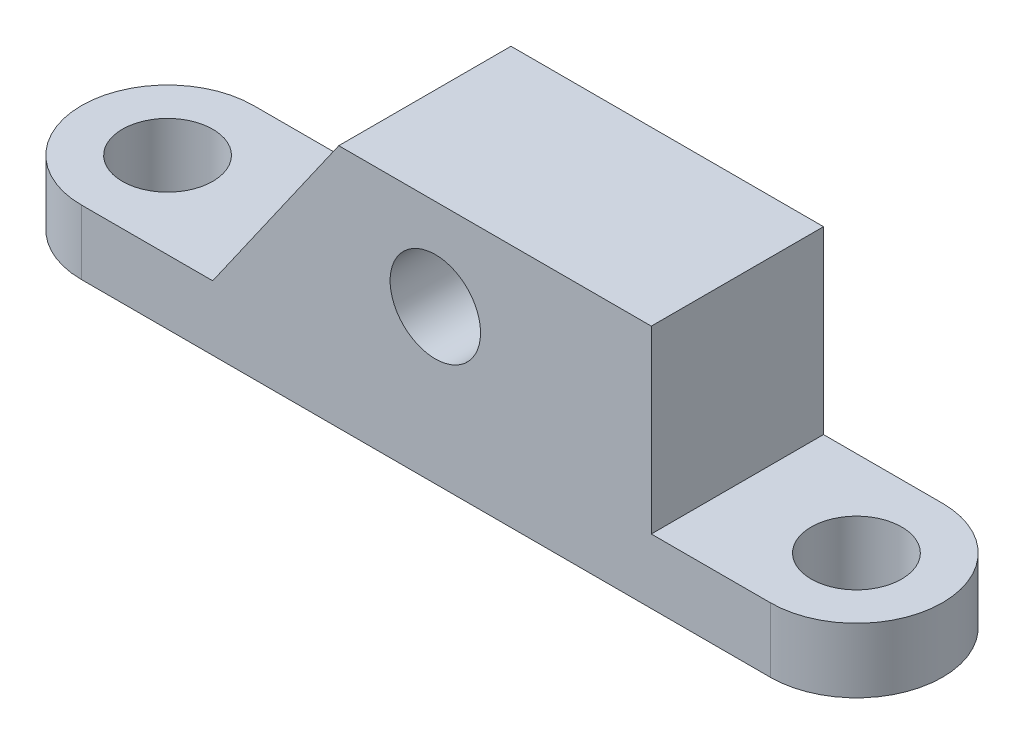
ISO-10303-21;
HEADER;
FILE_DESCRIPTION(('STEP AP214'),'2;1');
FILE_NAME('part.step','',(''),(''),'','','');
FILE_SCHEMA(('AUTOMOTIVE_DESIGN { 1 0 10303 214 1 1 1 1 }'));
ENDSEC;
DATA;
#1=APPLICATION_CONTEXT('core data for automotive mechanical design processes');
#2=APPLICATION_PROTOCOL_DEFINITION('international standard','automotive_design',2000,#1);
#3=PRODUCT_CONTEXT('',#1,'mechanical');
#4=PRODUCT('Part','Part','',(#3));
#5=PRODUCT_RELATED_PRODUCT_CATEGORY('part','',(#4));
#6=PRODUCT_DEFINITION_FORMATION('','',#4);
#7=PRODUCT_DEFINITION_CONTEXT('part definition',#1,'design');
#8=PRODUCT_DEFINITION('design','',#6,#7);
#9=PRODUCT_DEFINITION_SHAPE('','',#8);
#10=(LENGTH_UNIT() NAMED_UNIT(*) SI_UNIT(.MILLI.,.METRE.));
#11=(NAMED_UNIT(*) PLANE_ANGLE_UNIT() SI_UNIT($,.RADIAN.));
#12=(NAMED_UNIT(*) SI_UNIT($,.STERADIAN.) SOLID_ANGLE_UNIT());
#13=UNCERTAINTY_MEASURE_WITH_UNIT(LENGTH_MEASURE(1.E-05),#10,'distance_accuracy_value','');
#14=(GEOMETRIC_REPRESENTATION_CONTEXT(3) GLOBAL_UNCERTAINTY_ASSIGNED_CONTEXT((#13)) GLOBAL_UNIT_ASSIGNED_CONTEXT((#10,
#11,#12)) REPRESENTATION_CONTEXT('',''));
#15=CARTESIAN_POINT('',(0.,0.,0.));
#16=DIRECTION('',(0.,0.,1.));
#17=DIRECTION('',(1.,0.,0.));
#18=AXIS2_PLACEMENT_3D('',#15,#16,#17);
#19=CARTESIAN_POINT('',(0.,3.,0.));
#20=DIRECTION('',(0.,1.,0.));
#21=DIRECTION('',(0.,0.,1.));
#22=AXIS2_PLACEMENT_3D('',#19,#20,#21);
#23=PLANE('',#22);
#24=CARTESIAN_POINT('',(32.,3.,0.));
#25=DIRECTION('',(0.,1.,0.));
#26=DIRECTION('',(0.,0.,1.));
#27=AXIS2_PLACEMENT_3D('',#24,#25,#26);
#28=CIRCLE('',#27,2.1);
#29=CARTESIAN_POINT('',(32.,3.,2.1));
#30=VERTEX_POINT('',#29);
#31=EDGE_CURVE('E180',#30,#30,#28,.T.);
#32=ORIENTED_EDGE('',*,*,#31,.F.);
#33=EDGE_LOOP('',(#32));
#34=FACE_BOUND('',#33,.T.);
#35=DIRECTION('',(-1.,0.,0.));
#36=VECTOR('',#35,1.);
#37=CARTESIAN_POINT('',(0.,3.,-4.));
#38=LINE('',#37,#36);
#39=CARTESIAN_POINT('',(32.,3.,-4.));
#40=VERTEX_POINT('',#39);
#41=CARTESIAN_POINT('',(26.470573602195,3.,-4.));
#42=VERTEX_POINT('',#41);
#43=EDGE_CURVE('E121',#40,#42,#38,.T.);
#44=ORIENTED_EDGE('',*,*,#43,.T.);
#45=DIRECTION('',(0.,0.,1.));
#46=VECTOR('',#45,1.);
#47=CARTESIAN_POINT('',(26.470573602195,3.,-4.));
#48=LINE('',#47,#46);
#49=CARTESIAN_POINT('',(26.470573602195,3.,4.));
#50=VERTEX_POINT('',#49);
#51=EDGE_CURVE('E107',#42,#50,#48,.T.);
#52=ORIENTED_EDGE('',*,*,#51,.T.);
#53=DIRECTION('',(1.,0.,0.));
#54=VECTOR('',#53,1.);
#55=CARTESIAN_POINT('',(0.,3.,4.));
#56=LINE('',#55,#54);
#57=CARTESIAN_POINT('',(32.,3.,4.));
#58=VERTEX_POINT('',#57);
#59=EDGE_CURVE('E190',#50,#58,#56,.T.);
#60=ORIENTED_EDGE('',*,*,#59,.T.);
#61=CARTESIAN_POINT('',(32.,3.,0.));
#62=DIRECTION('',(0.,1.,0.));
#63=DIRECTION('',(0.,0.,1.));
#64=AXIS2_PLACEMENT_3D('',#61,#62,#63);
#65=CIRCLE('',#64,4.);
#66=EDGE_CURVE('E128',#58,#40,#65,.T.);
#67=ORIENTED_EDGE('',*,*,#66,.T.);
#68=EDGE_LOOP('',(#44,#52,#60,#67));
#69=FACE_BOUND('',#68,.T.);
#70=ADVANCED_FACE('F33',(#34,#69),#23,.T.);
#71=DIRECTION('',(0.,0.,1.));
#72=VECTOR('',#71,1.);
#73=CARTESIAN_POINT('',(6.09701451269219,3.,-4.));
#74=LINE('',#73,#72);
#75=CARTESIAN_POINT('',(6.09701451269219,3.,-4.));
#76=VERTEX_POINT('',#75);
#77=CARTESIAN_POINT('',(6.09701451269219,3.,4.));
#78=VERTEX_POINT('',#77);
#79=EDGE_CURVE('E175',#76,#78,#74,.T.);
#80=ORIENTED_EDGE('',*,*,#79,.F.);
#81=CARTESIAN_POINT('',(0.,3.,-4.));
#82=VERTEX_POINT('',#81);
#83=EDGE_CURVE('E57',#76,#82,#38,.T.);
#84=ORIENTED_EDGE('',*,*,#83,.T.);
#85=CARTESIAN_POINT('',(0.,3.,0.));
#86=DIRECTION('',(0.,1.,0.));
#87=DIRECTION('',(0.,0.,1.));
#88=AXIS2_PLACEMENT_3D('',#85,#86,#87);
#89=CIRCLE('',#88,4.);
#90=CARTESIAN_POINT('',(0.,3.,4.));
#91=VERTEX_POINT('',#90);
#92=EDGE_CURVE('E145',#82,#91,#89,.T.);
#93=ORIENTED_EDGE('',*,*,#92,.T.);
#94=EDGE_CURVE('E86',#91,#78,#56,.T.);
#95=ORIENTED_EDGE('',*,*,#94,.T.);
#96=EDGE_LOOP('',(#80,#84,#93,#95));
#97=FACE_BOUND('',#96,.T.);
#98=CARTESIAN_POINT('',(0.,3.,0.));
#99=DIRECTION('',(0.,1.,0.));
#100=DIRECTION('',(0.,0.,1.));
#101=AXIS2_PLACEMENT_3D('',#98,#99,#100);
#102=CIRCLE('',#101,2.1);
#103=CARTESIAN_POINT('',(0.,3.,2.1));
#104=VERTEX_POINT('',#103);
#105=EDGE_CURVE('E141',#104,#104,#102,.T.);
#106=ORIENTED_EDGE('',*,*,#105,.F.);
#107=EDGE_LOOP('',(#106));
#108=FACE_BOUND('',#107,.T.);
#109=ADVANCED_FACE('F194',(#97,#108),#23,.T.);
#110=CARTESIAN_POINT('',(0.,0.,0.));
#111=DIRECTION('',(0.,1.,0.));
#112=DIRECTION('',(0.,0.,1.));
#113=AXIS2_PLACEMENT_3D('',#110,#111,#112);
#114=PLANE('',#113);
#115=CARTESIAN_POINT('',(0.,0.,0.));
#116=DIRECTION('',(0.,1.,0.));
#117=DIRECTION('',(0.,0.,1.));
#118=AXIS2_PLACEMENT_3D('',#115,#116,#117);
#119=CIRCLE('',#118,4.);
#120=CARTESIAN_POINT('',(0.,0.,-4.));
#121=VERTEX_POINT('',#120);
#122=CARTESIAN_POINT('',(0.,0.,4.));
#123=VERTEX_POINT('',#122);
#124=EDGE_CURVE('E137',#121,#123,#119,.T.);
#125=ORIENTED_EDGE('',*,*,#124,.F.);
#126=DIRECTION('',(-1.,0.,0.));
#127=VECTOR('',#126,1.);
#128=CARTESIAN_POINT('',(0.,0.,-4.));
#129=LINE('',#128,#127);
#130=CARTESIAN_POINT('',(32.,0.,-4.));
#131=VERTEX_POINT('',#130);
#132=EDGE_CURVE('E79',#131,#121,#129,.T.);
#133=ORIENTED_EDGE('',*,*,#132,.F.);
#134=CARTESIAN_POINT('',(32.,0.,0.));
#135=DIRECTION('',(0.,1.,0.));
#136=DIRECTION('',(0.,0.,1.));
#137=AXIS2_PLACEMENT_3D('',#134,#135,#136);
#138=CIRCLE('',#137,4.);
#139=CARTESIAN_POINT('',(32.,0.,4.));
#140=VERTEX_POINT('',#139);
#141=EDGE_CURVE('E143',#140,#131,#138,.T.);
#142=ORIENTED_EDGE('',*,*,#141,.F.);
#143=DIRECTION('',(1.,0.,0.));
#144=VECTOR('',#143,1.);
#145=CARTESIAN_POINT('',(0.,0.,4.));
#146=LINE('',#145,#144);
#147=EDGE_CURVE('E140',#123,#140,#146,.T.);
#148=ORIENTED_EDGE('',*,*,#147,.F.);
#149=EDGE_LOOP('',(#125,#133,#142,#148));
#150=FACE_BOUND('',#149,.T.);
#151=CARTESIAN_POINT('',(0.,0.,0.));
#152=DIRECTION('',(0.,1.,0.));
#153=DIRECTION('',(0.,0.,1.));
#154=AXIS2_PLACEMENT_3D('',#151,#152,#153);
#155=CIRCLE('',#154,2.1);
#156=CARTESIAN_POINT('',(0.,0.,2.1));
#157=VERTEX_POINT('',#156);
#158=EDGE_CURVE('E183',#157,#157,#155,.T.);
#159=ORIENTED_EDGE('',*,*,#158,.T.);
#160=EDGE_LOOP('',(#159));
#161=FACE_BOUND('',#160,.T.);
#162=CARTESIAN_POINT('',(32.,0.,0.));
#163=DIRECTION('',(0.,1.,0.));
#164=DIRECTION('',(0.,0.,1.));
#165=AXIS2_PLACEMENT_3D('',#162,#163,#164);
#166=CIRCLE('',#165,2.1);
#167=CARTESIAN_POINT('',(32.,0.,2.1));
#168=VERTEX_POINT('',#167);
#169=EDGE_CURVE('E177',#168,#168,#166,.T.);
#170=ORIENTED_EDGE('',*,*,#169,.T.);
#171=EDGE_LOOP('',(#170));
#172=FACE_BOUND('',#171,.T.);
#173=ADVANCED_FACE('F154',(#150,#161,#172),#114,.F.);
#174=CARTESIAN_POINT('',(0.,3.,0.));
#175=DIRECTION('',(0.,-1.,0.));
#176=DIRECTION('',(0.,0.,-1.));
#177=AXIS2_PLACEMENT_3D('',#174,#175,#176);
#178=CYLINDRICAL_SURFACE('',#177,4.);
#179=ORIENTED_EDGE('',*,*,#124,.T.);
#180=DIRECTION('',(0.,-1.,0.));
#181=VECTOR('',#180,1.);
#182=CARTESIAN_POINT('',(0.,3.,4.));
#183=LINE('',#182,#181);
#184=EDGE_CURVE('E11',#91,#123,#183,.T.);
#185=ORIENTED_EDGE('',*,*,#184,.F.);
#186=ORIENTED_EDGE('',*,*,#92,.F.);
#187=DIRECTION('',(0.,-1.,0.));
#188=VECTOR('',#187,1.);
#189=CARTESIAN_POINT('',(0.,3.,-4.));
#190=LINE('',#189,#188);
#191=EDGE_CURVE('E130',#82,#121,#190,.T.);
#192=ORIENTED_EDGE('',*,*,#191,.T.);
#193=EDGE_LOOP('',(#179,#185,#186,#192));
#194=FACE_BOUND('',#193,.T.);
#195=ADVANCED_FACE('F35',(#194),#178,.T.);
#196=CARTESIAN_POINT('',(0.,3.,4.));
#197=DIRECTION('',(0.,0.,-1.));
#198=DIRECTION('',(-1.,0.,0.));
#199=AXIS2_PLACEMENT_3D('',#196,#197,#198);
#200=PLANE('',#199);
#201=ORIENTED_EDGE('',*,*,#147,.T.);
#202=DIRECTION('',(0.,-1.,0.));
#203=VECTOR('',#202,1.);
#204=CARTESIAN_POINT('',(32.,3.,4.));
#205=LINE('',#204,#203);
#206=EDGE_CURVE('E41',#58,#140,#205,.T.);
#207=ORIENTED_EDGE('',*,*,#206,.F.);
#208=ORIENTED_EDGE('',*,*,#59,.F.);
#209=DIRECTION('',(0.,1.,0.));
#210=VECTOR('',#209,1.);
#211=CARTESIAN_POINT('',(26.470573602195,11.3631685676695,4.));
#212=LINE('',#211,#210);
#213=CARTESIAN_POINT('',(26.470573602195,11.3631685676695,4.));
#214=VERTEX_POINT('',#213);
#215=EDGE_CURVE('E48',#50,#214,#212,.T.);
#216=ORIENTED_EDGE('',*,*,#215,.T.);
#217=DIRECTION('',(-1.,0.,0.));
#218=VECTOR('',#217,1.);
#219=CARTESIAN_POINT('',(26.470573602195,11.3631685676695,4.));
#220=LINE('',#219,#218);
#221=CARTESIAN_POINT('',(11.9529681870928,11.3631685676695,4.));
#222=VERTEX_POINT('',#221);
#223=EDGE_CURVE('E170',#214,#222,#220,.T.);
#224=ORIENTED_EDGE('',*,*,#223,.T.);
#225=DIRECTION('',(-0.573576436351044,-0.819152044288993,0.));
#226=VECTOR('',#225,1.);
#227=CARTESIAN_POINT('',(6.09701451269219,3.,4.));
#228=LINE('',#227,#226);
#229=EDGE_CURVE('E125',#222,#78,#228,.T.);
#230=ORIENTED_EDGE('',*,*,#229,.T.);
#231=ORIENTED_EDGE('',*,*,#94,.F.);
#232=ORIENTED_EDGE('',*,*,#184,.T.);
#233=EDGE_LOOP('',(#201,#207,#208,#216,#224,#230,#231,#232));
#234=FACE_BOUND('',#233,.T.);
#235=CARTESIAN_POINT('',(16.4383827980519,7.12709902541064,4.));
#236=DIRECTION('',(0.,0.,1.));
#237=DIRECTION('',(1.,0.,0.));
#238=AXIS2_PLACEMENT_3D('',#235,#236,#237);
#239=CIRCLE('',#238,2.1);
#240=CARTESIAN_POINT('',(18.5383827980519,7.12709902541064,4.));
#241=VERTEX_POINT('',#240);
#242=EDGE_CURVE('E297',#241,#241,#239,.T.);
#243=ORIENTED_EDGE('',*,*,#242,.F.);
#244=EDGE_LOOP('',(#243));
#245=FACE_BOUND('',#244,.T.);
#246=ADVANCED_FACE('F191',(#234,#245),#200,.F.);
#247=CARTESIAN_POINT('',(32.,3.,0.));
#248=DIRECTION('',(0.,-1.,0.));
#249=DIRECTION('',(0.,0.,-1.));
#250=AXIS2_PLACEMENT_3D('',#247,#248,#249);
#251=CYLINDRICAL_SURFACE('',#250,4.);
#252=ORIENTED_EDGE('',*,*,#141,.T.);
#253=DIRECTION('',(0.,-1.,0.));
#254=VECTOR('',#253,1.);
#255=CARTESIAN_POINT('',(32.,3.,-4.));
#256=LINE('',#255,#254);
#257=EDGE_CURVE('E132',#40,#131,#256,.T.);
#258=ORIENTED_EDGE('',*,*,#257,.F.);
#259=ORIENTED_EDGE('',*,*,#66,.F.);
#260=ORIENTED_EDGE('',*,*,#206,.T.);
#261=EDGE_LOOP('',(#252,#258,#259,#260));
#262=FACE_BOUND('',#261,.T.);
#263=ADVANCED_FACE('F151',(#262),#251,.T.);
#264=CARTESIAN_POINT('',(0.,3.,-4.));
#265=DIRECTION('',(0.,0.,1.));
#266=DIRECTION('',(1.,0.,0.));
#267=AXIS2_PLACEMENT_3D('',#264,#265,#266);
#268=PLANE('',#267);
#269=ORIENTED_EDGE('',*,*,#132,.T.);
#270=ORIENTED_EDGE('',*,*,#191,.F.);
#271=ORIENTED_EDGE('',*,*,#83,.F.);
#272=DIRECTION('',(-0.573576436351044,-0.819152044288993,0.));
#273=VECTOR('',#272,1.);
#274=CARTESIAN_POINT('',(6.09701451269219,3.,-4.));
#275=LINE('',#274,#273);
#276=CARTESIAN_POINT('',(11.9529681870928,11.3631685676695,-4.));
#277=VERTEX_POINT('',#276);
#278=EDGE_CURVE('E115',#277,#76,#275,.T.);
#279=ORIENTED_EDGE('',*,*,#278,.F.);
#280=DIRECTION('',(-1.,0.,0.));
#281=VECTOR('',#280,1.);
#282=CARTESIAN_POINT('',(26.470573602195,11.3631685676695,-4.));
#283=LINE('',#282,#281);
#284=CARTESIAN_POINT('',(26.470573602195,11.3631685676695,-4.));
#285=VERTEX_POINT('',#284);
#286=EDGE_CURVE('E124',#285,#277,#283,.T.);
#287=ORIENTED_EDGE('',*,*,#286,.F.);
#288=DIRECTION('',(0.,1.,0.));
#289=VECTOR('',#288,1.);
#290=CARTESIAN_POINT('',(26.470573602195,11.3631685676695,-4.));
#291=LINE('',#290,#289);
#292=EDGE_CURVE('E110',#42,#285,#291,.T.);
#293=ORIENTED_EDGE('',*,*,#292,.F.);
#294=ORIENTED_EDGE('',*,*,#43,.F.);
#295=ORIENTED_EDGE('',*,*,#257,.T.);
#296=EDGE_LOOP('',(#269,#270,#271,#279,#287,#293,#294,#295));
#297=FACE_BOUND('',#296,.T.);
#298=CARTESIAN_POINT('',(16.4383827980519,7.12709902541064,-4.));
#299=DIRECTION('',(0.,0.,1.));
#300=DIRECTION('',(1.,0.,0.));
#301=AXIS2_PLACEMENT_3D('',#298,#299,#300);
#302=CIRCLE('',#301,2.1);
#303=CARTESIAN_POINT('',(18.5383827980519,7.12709902541064,-4.));
#304=VERTEX_POINT('',#303);
#305=EDGE_CURVE('E171',#304,#304,#302,.T.);
#306=ORIENTED_EDGE('',*,*,#305,.T.);
#307=EDGE_LOOP('',(#306));
#308=FACE_BOUND('',#307,.T.);
#309=ADVANCED_FACE('F119',(#297,#308),#268,.F.);
#310=CARTESIAN_POINT('',(0.,3.,0.));
#311=DIRECTION('',(0.,-1.,0.));
#312=DIRECTION('',(0.,0.,-1.));
#313=AXIS2_PLACEMENT_3D('',#310,#311,#312);
#314=CYLINDRICAL_SURFACE('',#313,2.1);
#315=ORIENTED_EDGE('',*,*,#105,.T.);
#316=EDGE_LOOP('',(#315));
#317=FACE_BOUND('',#316,.T.);
#318=ORIENTED_EDGE('',*,*,#158,.F.);
#319=EDGE_LOOP('',(#318));
#320=FACE_BOUND('',#319,.T.);
#321=ADVANCED_FACE('F200',(#317,#320),#314,.F.);
#322=CARTESIAN_POINT('',(32.,3.,0.));
#323=DIRECTION('',(0.,-1.,0.));
#324=DIRECTION('',(0.,0.,-1.));
#325=AXIS2_PLACEMENT_3D('',#322,#323,#324);
#326=CYLINDRICAL_SURFACE('',#325,2.1);
#327=ORIENTED_EDGE('',*,*,#31,.T.);
#328=EDGE_LOOP('',(#327));
#329=FACE_BOUND('',#328,.T.);
#330=ORIENTED_EDGE('',*,*,#169,.F.);
#331=EDGE_LOOP('',(#330));
#332=FACE_BOUND('',#331,.T.);
#333=ADVANCED_FACE('F203',(#329,#332),#326,.F.);
#334=CARTESIAN_POINT('',(6.09701451269219,3.,-4.));
#335=DIRECTION('',(-0.819152044288993,0.573576436351044,0.));
#336=DIRECTION('',(-0.573576436351044,-0.819152044288993,0.));
#337=AXIS2_PLACEMENT_3D('',#334,#335,#336);
#338=PLANE('',#337);
#339=ORIENTED_EDGE('',*,*,#229,.F.);
#340=DIRECTION('',(0.,0.,1.));
#341=VECTOR('',#340,1.);
#342=CARTESIAN_POINT('',(11.9529681870928,11.3631685676695,-4.));
#343=LINE('',#342,#341);
#344=EDGE_CURVE('E164',#277,#222,#343,.T.);
#345=ORIENTED_EDGE('',*,*,#344,.F.);
#346=ORIENTED_EDGE('',*,*,#278,.T.);
#347=ORIENTED_EDGE('',*,*,#79,.T.);
#348=EDGE_LOOP('',(#339,#345,#346,#347));
#349=FACE_BOUND('',#348,.T.);
#350=ADVANCED_FACE('F193',(#349),#338,.T.);
#351=CARTESIAN_POINT('',(26.470573602195,11.3631685676695,-4.));
#352=DIRECTION('',(0.,1.,0.));
#353=DIRECTION('',(0.,0.,1.));
#354=AXIS2_PLACEMENT_3D('',#351,#352,#353);
#355=PLANE('',#354);
#356=ORIENTED_EDGE('',*,*,#223,.F.);
#357=DIRECTION('',(0.,0.,1.));
#358=VECTOR('',#357,1.);
#359=CARTESIAN_POINT('',(26.470573602195,11.3631685676695,-4.));
#360=LINE('',#359,#358);
#361=EDGE_CURVE('E114',#285,#214,#360,.T.);
#362=ORIENTED_EDGE('',*,*,#361,.F.);
#363=ORIENTED_EDGE('',*,*,#286,.T.);
#364=ORIENTED_EDGE('',*,*,#344,.T.);
#365=EDGE_LOOP('',(#356,#362,#363,#364));
#366=FACE_BOUND('',#365,.T.);
#367=ADVANCED_FACE('F163',(#366),#355,.T.);
#368=CARTESIAN_POINT('',(26.470573602195,11.3631685676695,-4.));
#369=DIRECTION('',(1.,0.,0.));
#370=DIRECTION('',(0.,0.,-1.));
#371=AXIS2_PLACEMENT_3D('',#368,#369,#370);
#372=PLANE('',#371);
#373=ORIENTED_EDGE('',*,*,#215,.F.);
#374=ORIENTED_EDGE('',*,*,#51,.F.);
#375=ORIENTED_EDGE('',*,*,#292,.T.);
#376=ORIENTED_EDGE('',*,*,#361,.T.);
#377=EDGE_LOOP('',(#373,#374,#375,#376));
#378=FACE_BOUND('',#377,.T.);
#379=ADVANCED_FACE('F109',(#378),#372,.T.);
#380=CARTESIAN_POINT('',(16.4383827980519,7.12709902541064,-4.));
#381=DIRECTION('',(0.,0.,1.));
#382=DIRECTION('',(1.,0.,0.));
#383=AXIS2_PLACEMENT_3D('',#380,#381,#382);
#384=CYLINDRICAL_SURFACE('',#383,2.1);
#385=ORIENTED_EDGE('',*,*,#305,.F.);
#386=EDGE_LOOP('',(#385));
#387=FACE_BOUND('',#386,.T.);
#388=ORIENTED_EDGE('',*,*,#242,.T.);
#389=EDGE_LOOP('',(#388));
#390=FACE_BOUND('',#389,.T.);
#391=ADVANCED_FACE('F280',(#387,#390),#384,.F.);
#392=CLOSED_SHELL('',(#70,#109,#173,#195,#246,#263,#309,#321,#333,#350,#367,#379,#391));
#393=MANIFOLD_SOLID_BREP('B2',#392);
#394=ADVANCED_BREP_SHAPE_REPRESENTATION('',(#18,#393),#14);
#395=SHAPE_DEFINITION_REPRESENTATION(#9,#394);
ENDSEC;
END-ISO-10303-21;
